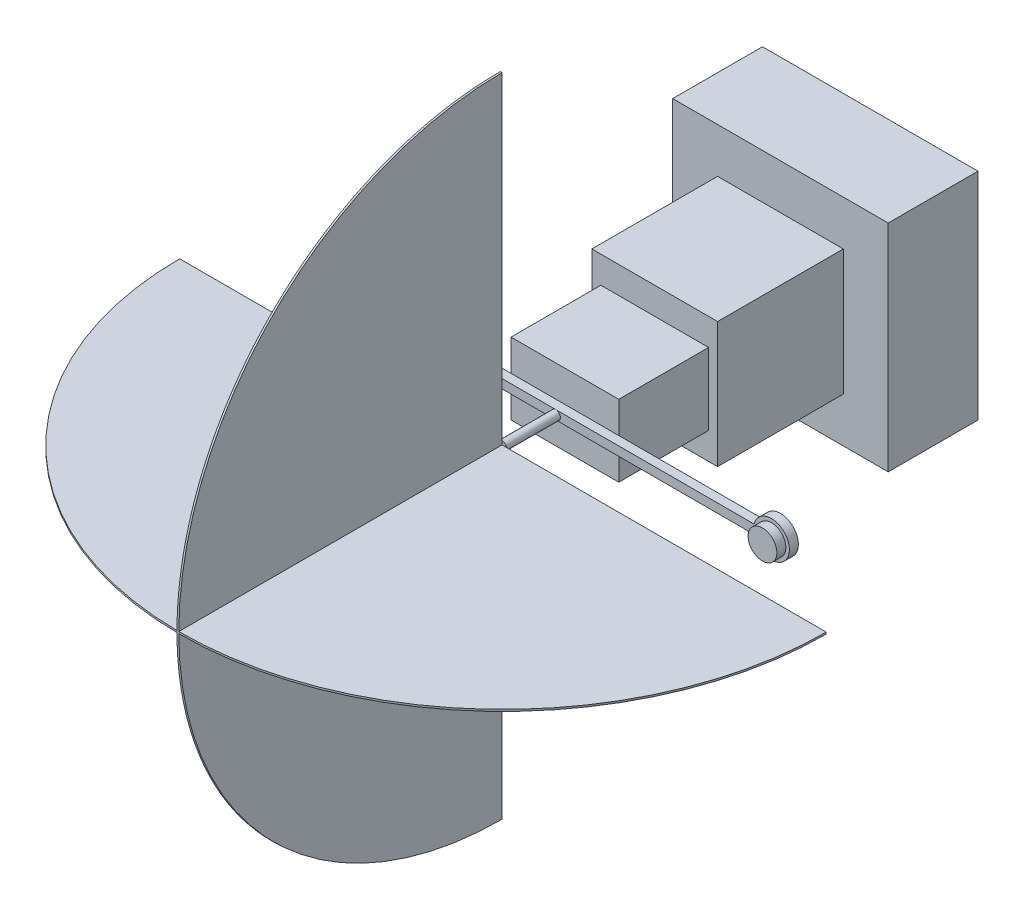
ISO-10303-21;
HEADER;
FILE_DESCRIPTION(('STEP AP214'),'2;1');
FILE_NAME('part.step','',(''),(''),'','','');
FILE_SCHEMA(('AUTOMOTIVE_DESIGN { 1 0 10303 214 1 1 1 1 }'));
ENDSEC;
DATA;
#1=APPLICATION_CONTEXT('core data for automotive mechanical design processes');
#2=APPLICATION_PROTOCOL_DEFINITION('international standard','automotive_design',2000,#1);
#3=PRODUCT_CONTEXT('',#1,'mechanical');
#4=PRODUCT('Part','Part','',(#3));
#5=PRODUCT_RELATED_PRODUCT_CATEGORY('part','',(#4));
#6=PRODUCT_DEFINITION_FORMATION('','',#4);
#7=PRODUCT_DEFINITION_CONTEXT('part definition',#1,'design');
#8=PRODUCT_DEFINITION('design','',#6,#7);
#9=PRODUCT_DEFINITION_SHAPE('','',#8);
#10=(LENGTH_UNIT() NAMED_UNIT(*) SI_UNIT(.MILLI.,.METRE.));
#11=(NAMED_UNIT(*) PLANE_ANGLE_UNIT() SI_UNIT($,.RADIAN.));
#12=(NAMED_UNIT(*) SI_UNIT($,.STERADIAN.) SOLID_ANGLE_UNIT());
#13=UNCERTAINTY_MEASURE_WITH_UNIT(LENGTH_MEASURE(1.E-05),#10,'distance_accuracy_value','');
#14=(GEOMETRIC_REPRESENTATION_CONTEXT(3) GLOBAL_UNCERTAINTY_ASSIGNED_CONTEXT((#13)) GLOBAL_UNIT_ASSIGNED_CONTEXT((#10,
#11,#12)) REPRESENTATION_CONTEXT('',''));
#15=CARTESIAN_POINT('',(0.,0.,0.));
#16=DIRECTION('',(0.,0.,1.));
#17=DIRECTION('',(1.,0.,0.));
#18=AXIS2_PLACEMENT_3D('',#15,#16,#17);
#19=CARTESIAN_POINT('',(0.,0.,35.));
#20=DIRECTION('',(0.,0.,1.));
#21=DIRECTION('',(1.,0.,0.));
#22=AXIS2_PLACEMENT_3D('',#19,#20,#21);
#23=PLANE('',#22);
#24=DIRECTION('',(-1.,0.,0.));
#25=VECTOR('',#24,1.);
#26=CARTESIAN_POINT('',(0.,-0.499999999999996,35.));
#27=LINE('',#26,#25);
#28=CARTESIAN_POINT('',(2.44948974278311,-0.499999999999996,35.));
#29=VERTEX_POINT('',#28);
#30=CARTESIAN_POINT('',(0.,-0.499999999999917,35.));
#31=VERTEX_POINT('',#30);
#32=EDGE_CURVE('E551',#29,#31,#27,.T.);
#33=ORIENTED_EDGE('',*,*,#32,.T.);
#34=DIRECTION('',(0.,-1.,0.));
#35=VECTOR('',#34,1.);
#36=CARTESIAN_POINT('',(0.,180.,35.));
#37=LINE('',#36,#35);
#38=CARTESIAN_POINT('',(0.,-2.5,35.));
#39=VERTEX_POINT('',#38);
#40=EDGE_CURVE('E644',#31,#39,#37,.T.);
#41=ORIENTED_EDGE('',*,*,#40,.T.);
#42=CARTESIAN_POINT('',(0.,0.,35.));
#43=DIRECTION('',(0.,0.,1.));
#44=DIRECTION('',(1.,0.,0.));
#45=AXIS2_PLACEMENT_3D('',#42,#43,#44);
#46=CIRCLE('',#45,2.5);
#47=EDGE_CURVE('E436',#39,#29,#46,.T.);
#48=ORIENTED_EDGE('',*,*,#47,.T.);
#49=EDGE_LOOP('',(#33,#41,#48));
#50=FACE_BOUND('',#49,.T.);
#51=ADVANCED_FACE('F83',(#50),#23,.T.);
#52=CARTESIAN_POINT('',(2.44948974278311,0.500000000000004,35.));
#53=VERTEX_POINT('',#52);
#54=CARTESIAN_POINT('',(0.,2.50000000000006,35.));
#55=VERTEX_POINT('',#54);
#56=EDGE_CURVE('E431',#53,#55,#46,.T.);
#57=ORIENTED_EDGE('',*,*,#56,.T.);
#58=CARTESIAN_POINT('',(0.,0.500000000000084,35.));
#59=VERTEX_POINT('',#58);
#60=EDGE_CURVE('E645',#55,#59,#37,.T.);
#61=ORIENTED_EDGE('',*,*,#60,.T.);
#62=DIRECTION('',(-1.,0.,0.));
#63=VECTOR('',#62,1.);
#64=CARTESIAN_POINT('',(0.,0.500000000000004,35.));
#65=LINE('',#64,#63);
#66=EDGE_CURVE('E555',#53,#59,#65,.T.);
#67=ORIENTED_EDGE('',*,*,#66,.F.);
#68=EDGE_LOOP('',(#57,#61,#67));
#69=FACE_BOUND('',#68,.T.);
#70=ADVANCED_FACE('F618',(#69),#23,.T.);
#71=CARTESIAN_POINT('',(0.499999999999998,0.500000000000004,35.));
#72=DIRECTION('',(0.,-1.,0.));
#73=DIRECTION('',(0.,0.,-1.));
#74=AXIS2_PLACEMENT_3D('',#71,#72,#73);
#75=CYLINDRICAL_SURFACE('',#74,180.);
#76=CARTESIAN_POINT('',(0.499999999999998,0.500000000000004,35.));
#77=DIRECTION('',(0.,-1.,0.));
#78=DIRECTION('',(0.,0.,1.));
#79=AXIS2_PLACEMENT_3D('',#76,#77,#78);
#80=CIRCLE('',#79,180.);
#81=CARTESIAN_POINT('',(180.5,0.500000000000004,35.));
#82=VERTEX_POINT('',#81);
#83=CARTESIAN_POINT('',(0.,0.500000000000026,214.999305554216));
#84=VERTEX_POINT('',#83);
#85=EDGE_CURVE('E407',#82,#84,#80,.T.);
#86=ORIENTED_EDGE('',*,*,#85,.T.);
#87=CARTESIAN_POINT('',(0.,0.,35.));
#88=DIRECTION('',(-1.,0.,0.));
#89=DIRECTION('',(0.,-0.00277777777777813,0.999996141967866));
#90=AXIS2_PLACEMENT_3D('',#87,#88,#89);
#91=CIRCLE('',#90,180.);
#92=CARTESIAN_POINT('',(0.,-0.499999999999974,214.999305554216));
#93=VERTEX_POINT('',#92);
#94=EDGE_CURVE('E356',#93,#84,#91,.T.);
#95=ORIENTED_EDGE('',*,*,#94,.F.);
#96=CARTESIAN_POINT('',(0.499999999999998,-0.499999999999996,35.));
#97=DIRECTION('',(0.,-1.,0.));
#98=DIRECTION('',(0.,0.,1.));
#99=AXIS2_PLACEMENT_3D('',#96,#97,#98);
#100=CIRCLE('',#99,180.);
#101=CARTESIAN_POINT('',(180.5,-0.499999999999996,35.));
#102=VERTEX_POINT('',#101);
#103=EDGE_CURVE('E87',#102,#93,#100,.T.);
#104=ORIENTED_EDGE('',*,*,#103,.F.);
#105=DIRECTION('',(0.,-1.,0.));
#106=VECTOR('',#105,1.);
#107=CARTESIAN_POINT('',(180.5,0.500000000000004,35.));
#108=LINE('',#107,#106);
#109=EDGE_CURVE('E425',#82,#102,#108,.T.);
#110=ORIENTED_EDGE('',*,*,#109,.F.);
#111=EDGE_LOOP('',(#86,#95,#104,#110));
#112=FACE_BOUND('',#111,.T.);
#113=ADVANCED_FACE('F399',(#112),#75,.T.);
#114=CARTESIAN_POINT('',(0.499999999999998,0.500000000000004,35.));
#115=DIRECTION('',(0.,1.,0.));
#116=DIRECTION('',(0.,0.,1.));
#117=AXIS2_PLACEMENT_3D('',#114,#115,#116);
#118=PLANE('',#117);
#119=ORIENTED_EDGE('',*,*,#66,.T.);
#120=DIRECTION('',(0.,0.,1.));
#121=VECTOR('',#120,1.);
#122=CARTESIAN_POINT('',(0.,0.500000000000004,35.));
#123=LINE('',#122,#121);
#124=EDGE_CURVE('E560',#59,#84,#123,.T.);
#125=ORIENTED_EDGE('',*,*,#124,.T.);
#126=ORIENTED_EDGE('',*,*,#85,.F.);
#127=DIRECTION('',(1.,0.,0.));
#128=VECTOR('',#127,1.);
#129=CARTESIAN_POINT('',(-179.5,0.500000000000004,35.));
#130=LINE('',#129,#128);
#131=EDGE_CURVE('E415',#53,#82,#130,.T.);
#132=ORIENTED_EDGE('',*,*,#131,.F.);
#133=EDGE_LOOP('',(#119,#125,#126,#132));
#134=FACE_BOUND('',#133,.T.);
#135=ADVANCED_FACE('F388',(#134),#118,.T.);
#136=CARTESIAN_POINT('',(0.499999999999998,-0.499999999999996,35.));
#137=DIRECTION('',(0.,1.,0.));
#138=DIRECTION('',(0.,0.,1.));
#139=AXIS2_PLACEMENT_3D('',#136,#137,#138);
#140=PLANE('',#139);
#141=DIRECTION('',(0.,0.,1.));
#142=VECTOR('',#141,1.);
#143=CARTESIAN_POINT('',(0.,-0.499999999999996,35.));
#144=LINE('',#143,#142);
#145=EDGE_CURVE('E12',#31,#93,#144,.T.);
#146=ORIENTED_EDGE('',*,*,#145,.F.);
#147=ORIENTED_EDGE('',*,*,#32,.F.);
#148=DIRECTION('',(1.,0.,0.));
#149=VECTOR('',#148,1.);
#150=CARTESIAN_POINT('',(-179.5,-0.499999999999996,35.));
#151=LINE('',#150,#149);
#152=EDGE_CURVE('E606',#29,#102,#151,.T.);
#153=ORIENTED_EDGE('',*,*,#152,.T.);
#154=ORIENTED_EDGE('',*,*,#103,.T.);
#155=EDGE_LOOP('',(#146,#147,#153,#154));
#156=FACE_BOUND('',#155,.T.);
#157=ADVANCED_FACE('F383',(#156),#140,.F.);
#158=DIRECTION('',(0.,-1.,0.));
#159=VECTOR('',#158,1.);
#160=CARTESIAN_POINT('',(-1.,180.,35.));
#161=LINE('',#160,#159);
#162=CARTESIAN_POINT('',(-1.,-0.499999999999917,35.));
#163=VERTEX_POINT('',#162);
#164=CARTESIAN_POINT('',(-1.,-2.29128784747792,35.));
#165=VERTEX_POINT('',#164);
#166=EDGE_CURVE('E581',#163,#165,#161,.T.);
#167=ORIENTED_EDGE('',*,*,#166,.F.);
#168=CARTESIAN_POINT('',(-2.44948974278318,-0.499999999999996,35.));
#169=VERTEX_POINT('',#168);
#170=EDGE_CURVE('E108',#163,#169,#27,.T.);
#171=ORIENTED_EDGE('',*,*,#170,.T.);
#172=EDGE_CURVE('E593',#169,#165,#46,.T.);
#173=ORIENTED_EDGE('',*,*,#172,.T.);
#174=EDGE_LOOP('',(#167,#171,#173));
#175=FACE_BOUND('',#174,.T.);
#176=ADVANCED_FACE('F599',(#175),#23,.T.);
#177=CARTESIAN_POINT('',(0.,0.,5.));
#178=DIRECTION('',(0.,0.,1.));
#179=DIRECTION('',(1.,0.,0.));
#180=AXIS2_PLACEMENT_3D('',#177,#178,#179);
#181=PLANE('',#180);
#182=CARTESIAN_POINT('',(-120.,0.,5.));
#183=DIRECTION('',(0.,0.,1.));
#184=DIRECTION('',(1.,0.,0.));
#185=AXIS2_PLACEMENT_3D('',#182,#183,#184);
#186=CIRCLE('',#185,8.00000000000001);
#187=CARTESIAN_POINT('',(-112.,0.,5.));
#188=VERTEX_POINT('',#187);
#189=EDGE_CURVE('E503',#188,#188,#186,.T.);
#190=ORIENTED_EDGE('',*,*,#189,.F.);
#191=EDGE_LOOP('',(#190));
#192=FACE_BOUND('',#191,.T.);
#193=DIRECTION('',(1.,0.,0.));
#194=VECTOR('',#193,1.);
#195=CARTESIAN_POINT('',(0.,-2.5,5.));
#196=LINE('',#195,#194);
#197=CARTESIAN_POINT('',(-110.317541634481,-2.5,5.));
#198=VERTEX_POINT('',#197);
#199=CARTESIAN_POINT('',(0.,-2.5,5.));
#200=VERTEX_POINT('',#199);
#201=EDGE_CURVE('E517',#198,#200,#196,.T.);
#202=ORIENTED_EDGE('',*,*,#201,.T.);
#203=CARTESIAN_POINT('',(0.,0.,5.));
#204=DIRECTION('',(0.,0.,1.));
#205=DIRECTION('',(1.,0.,0.));
#206=AXIS2_PLACEMENT_3D('',#203,#204,#205);
#207=CIRCLE('',#206,2.5);
#208=CARTESIAN_POINT('',(0.,2.5,5.));
#209=VERTEX_POINT('',#208);
#210=EDGE_CURVE('E438',#209,#200,#207,.T.);
#211=ORIENTED_EDGE('',*,*,#210,.F.);
#212=DIRECTION('',(1.,0.,0.));
#213=VECTOR('',#212,1.);
#214=CARTESIAN_POINT('',(0.,2.5,5.));
#215=LINE('',#214,#213);
#216=CARTESIAN_POINT('',(-110.317541634481,2.5,5.));
#217=VERTEX_POINT('',#216);
#218=EDGE_CURVE('E521',#217,#209,#215,.T.);
#219=ORIENTED_EDGE('',*,*,#218,.F.);
#220=CARTESIAN_POINT('',(-120.,0.,5.));
#221=DIRECTION('',(0.,0.,1.));
#222=DIRECTION('',(1.,0.,0.));
#223=AXIS2_PLACEMENT_3D('',#220,#221,#222);
#224=CIRCLE('',#223,9.99999999999999);
#225=EDGE_CURVE('E512',#217,#198,#224,.T.);
#226=ORIENTED_EDGE('',*,*,#225,.T.);
#227=EDGE_LOOP('',(#202,#211,#219,#226));
#228=FACE_BOUND('',#227,.T.);
#229=ADVANCED_FACE('F630',(#192,#228),#181,.T.);
#230=CARTESIAN_POINT('',(120.,0.,5.));
#231=DIRECTION('',(0.,0.,1.));
#232=DIRECTION('',(1.,0.,0.));
#233=AXIS2_PLACEMENT_3D('',#230,#231,#232);
#234=CIRCLE('',#233,8.00000000000001);
#235=CARTESIAN_POINT('',(128.,0.,5.));
#236=VERTEX_POINT('',#235);
#237=EDGE_CURVE('E499',#236,#236,#234,.T.);
#238=ORIENTED_EDGE('',*,*,#237,.F.);
#239=EDGE_LOOP('',(#238));
#240=FACE_BOUND('',#239,.T.);
#241=CARTESIAN_POINT('',(110.317541634481,2.5,5.));
#242=VERTEX_POINT('',#241);
#243=EDGE_CURVE('E520',#209,#242,#215,.T.);
#244=ORIENTED_EDGE('',*,*,#243,.F.);
#245=EDGE_CURVE('E428',#200,#209,#207,.T.);
#246=ORIENTED_EDGE('',*,*,#245,.F.);
#247=CARTESIAN_POINT('',(110.317541634481,-2.5,5.));
#248=VERTEX_POINT('',#247);
#249=EDGE_CURVE('E515',#200,#248,#196,.T.);
#250=ORIENTED_EDGE('',*,*,#249,.T.);
#251=CARTESIAN_POINT('',(120.,0.,5.));
#252=DIRECTION('',(0.,0.,1.));
#253=DIRECTION('',(1.,0.,0.));
#254=AXIS2_PLACEMENT_3D('',#251,#252,#253);
#255=CIRCLE('',#254,10.);
#256=EDGE_CURVE('E541',#248,#242,#255,.T.);
#257=ORIENTED_EDGE('',*,*,#256,.T.);
#258=EDGE_LOOP('',(#244,#246,#250,#257));
#259=FACE_BOUND('',#258,.T.);
#260=ADVANCED_FACE('F636',(#240,#259),#181,.T.);
#261=CARTESIAN_POINT('',(0.,0.,0.));
#262=DIRECTION('',(0.,0.,1.));
#263=DIRECTION('',(1.,0.,0.));
#264=AXIS2_PLACEMENT_3D('',#261,#262,#263);
#265=PLANE('',#264);
#266=DIRECTION('',(0.,1.,0.));
#267=VECTOR('',#266,1.);
#268=CARTESIAN_POINT('',(-30.,-20.,0.));
#269=LINE('',#268,#267);
#270=CARTESIAN_POINT('',(-30.,-2.5,0.));
#271=VERTEX_POINT('',#270);
#272=CARTESIAN_POINT('',(-30.,2.5,0.));
#273=VERTEX_POINT('',#272);
#274=EDGE_CURVE('E480',#271,#273,#269,.T.);
#275=ORIENTED_EDGE('',*,*,#274,.F.);
#276=DIRECTION('',(1.,0.,0.));
#277=VECTOR('',#276,1.);
#278=CARTESIAN_POINT('',(0.,-2.5,0.));
#279=LINE('',#278,#277);
#280=CARTESIAN_POINT('',(-110.317541634481,-2.5,0.));
#281=VERTEX_POINT('',#280);
#282=EDGE_CURVE('E530',#281,#271,#279,.T.);
#283=ORIENTED_EDGE('',*,*,#282,.F.);
#284=CARTESIAN_POINT('',(-120.,0.,0.));
#285=DIRECTION('',(0.,0.,1.));
#286=DIRECTION('',(1.,0.,0.));
#287=AXIS2_PLACEMENT_3D('',#284,#285,#286);
#288=CIRCLE('',#287,9.99999999999999);
#289=CARTESIAN_POINT('',(-110.317541634481,2.5,0.));
#290=VERTEX_POINT('',#289);
#291=EDGE_CURVE('E525',#290,#281,#288,.T.);
#292=ORIENTED_EDGE('',*,*,#291,.F.);
#293=DIRECTION('',(1.,0.,0.));
#294=VECTOR('',#293,1.);
#295=CARTESIAN_POINT('',(0.,2.5,0.));
#296=LINE('',#295,#294);
#297=EDGE_CURVE('E516',#290,#273,#296,.T.);
#298=ORIENTED_EDGE('',*,*,#297,.T.);
#299=EDGE_LOOP('',(#275,#283,#292,#298));
#300=FACE_BOUND('',#299,.T.);
#301=ADVANCED_FACE('F910',(#300),#265,.F.);
#302=DIRECTION('',(0.,-1.,0.));
#303=VECTOR('',#302,1.);
#304=CARTESIAN_POINT('',(30.,-20.,0.));
#305=LINE('',#304,#303);
#306=CARTESIAN_POINT('',(30.,2.5,0.));
#307=VERTEX_POINT('',#306);
#308=CARTESIAN_POINT('',(30.,-2.5,0.));
#309=VERTEX_POINT('',#308);
#310=EDGE_CURVE('E486',#307,#309,#305,.T.);
#311=ORIENTED_EDGE('',*,*,#310,.F.);
#312=CARTESIAN_POINT('',(110.317541634481,2.5,0.));
#313=VERTEX_POINT('',#312);
#314=EDGE_CURVE('E533',#307,#313,#296,.T.);
#315=ORIENTED_EDGE('',*,*,#314,.T.);
#316=CARTESIAN_POINT('',(120.,0.,0.));
#317=DIRECTION('',(0.,0.,1.));
#318=DIRECTION('',(1.,0.,0.));
#319=AXIS2_PLACEMENT_3D('',#316,#317,#318);
#320=CIRCLE('',#319,10.);
#321=CARTESIAN_POINT('',(110.317541634481,-2.5,0.));
#322=VERTEX_POINT('',#321);
#323=EDGE_CURVE('E509',#322,#313,#320,.T.);
#324=ORIENTED_EDGE('',*,*,#323,.F.);
#325=EDGE_CURVE('E528',#309,#322,#279,.T.);
#326=ORIENTED_EDGE('',*,*,#325,.F.);
#327=EDGE_LOOP('',(#311,#315,#324,#326));
#328=FACE_BOUND('',#327,.T.);
#329=ADVANCED_FACE('F891',(#328),#265,.F.);
#330=CARTESIAN_POINT('',(0.,-2.5,5.));
#331=DIRECTION('',(0.,1.,0.));
#332=DIRECTION('',(0.,0.,1.));
#333=AXIS2_PLACEMENT_3D('',#330,#331,#332);
#334=PLANE('',#333);
#335=ORIENTED_EDGE('',*,*,#282,.T.);
#336=EDGE_CURVE('E534',#271,#309,#279,.T.);
#337=ORIENTED_EDGE('',*,*,#336,.T.);
#338=ORIENTED_EDGE('',*,*,#325,.T.);
#339=DIRECTION('',(0.,0.,-1.));
#340=VECTOR('',#339,1.);
#341=CARTESIAN_POINT('',(110.317541634481,-2.5,5.));
#342=LINE('',#341,#340);
#343=EDGE_CURVE('E529',#248,#322,#342,.T.);
#344=ORIENTED_EDGE('',*,*,#343,.F.);
#345=ORIENTED_EDGE('',*,*,#249,.F.);
#346=ORIENTED_EDGE('',*,*,#201,.F.);
#347=DIRECTION('',(0.,0.,-1.));
#348=VECTOR('',#347,1.);
#349=CARTESIAN_POINT('',(-110.317541634481,-2.5,5.));
#350=LINE('',#349,#348);
#351=EDGE_CURVE('E539',#198,#281,#350,.T.);
#352=ORIENTED_EDGE('',*,*,#351,.T.);
#353=EDGE_LOOP('',(#335,#337,#338,#344,#345,#346,#352));
#354=FACE_BOUND('',#353,.T.);
#355=ADVANCED_FACE('F884',(#354),#334,.F.);
#356=CARTESIAN_POINT('',(0.,2.5,5.));
#357=DIRECTION('',(0.,1.,0.));
#358=DIRECTION('',(0.,0.,1.));
#359=AXIS2_PLACEMENT_3D('',#356,#357,#358);
#360=PLANE('',#359);
#361=ORIENTED_EDGE('',*,*,#297,.F.);
#362=DIRECTION('',(0.,0.,-1.));
#363=VECTOR('',#362,1.);
#364=CARTESIAN_POINT('',(-110.317541634481,2.5,5.));
#365=LINE('',#364,#363);
#366=EDGE_CURVE('E524',#217,#290,#365,.T.);
#367=ORIENTED_EDGE('',*,*,#366,.F.);
#368=ORIENTED_EDGE('',*,*,#218,.T.);
#369=ORIENTED_EDGE('',*,*,#243,.T.);
#370=DIRECTION('',(0.,0.,-1.));
#371=VECTOR('',#370,1.);
#372=CARTESIAN_POINT('',(110.317541634481,2.5,5.));
#373=LINE('',#372,#371);
#374=EDGE_CURVE('E544',#242,#313,#373,.T.);
#375=ORIENTED_EDGE('',*,*,#374,.T.);
#376=ORIENTED_EDGE('',*,*,#314,.F.);
#377=EDGE_CURVE('E537',#273,#307,#296,.T.);
#378=ORIENTED_EDGE('',*,*,#377,.F.);
#379=EDGE_LOOP('',(#361,#367,#368,#369,#375,#376,#378));
#380=FACE_BOUND('',#379,.T.);
#381=ADVANCED_FACE('F896',(#380),#360,.T.);
#382=CARTESIAN_POINT('',(-120.,0.,5.));
#383=DIRECTION('',(0.,0.,-1.));
#384=DIRECTION('',(-1.,0.,0.));
#385=AXIS2_PLACEMENT_3D('',#382,#383,#384);
#386=CYLINDRICAL_SURFACE('',#385,9.99999999999999);
#387=ORIENTED_EDGE('',*,*,#291,.T.);
#388=ORIENTED_EDGE('',*,*,#351,.F.);
#389=ORIENTED_EDGE('',*,*,#225,.F.);
#390=ORIENTED_EDGE('',*,*,#366,.T.);
#391=EDGE_LOOP('',(#387,#388,#389,#390));
#392=FACE_BOUND('',#391,.T.);
#393=ADVANCED_FACE('F906',(#392),#386,.T.);
#394=CARTESIAN_POINT('',(120.,0.,5.));
#395=DIRECTION('',(0.,0.,-1.));
#396=DIRECTION('',(-1.,0.,0.));
#397=AXIS2_PLACEMENT_3D('',#394,#395,#396);
#398=CYLINDRICAL_SURFACE('',#397,10.);
#399=ORIENTED_EDGE('',*,*,#323,.T.);
#400=ORIENTED_EDGE('',*,*,#374,.F.);
#401=ORIENTED_EDGE('',*,*,#256,.F.);
#402=ORIENTED_EDGE('',*,*,#343,.T.);
#403=EDGE_LOOP('',(#399,#400,#401,#402));
#404=FACE_BOUND('',#403,.T.);
#405=ADVANCED_FACE('F85',(#404),#398,.T.);
#406=CARTESIAN_POINT('',(-120.,0.,10.));
#407=DIRECTION('',(0.,0.,-1.));
#408=DIRECTION('',(-1.,0.,0.));
#409=AXIS2_PLACEMENT_3D('',#406,#407,#408);
#410=CYLINDRICAL_SURFACE('',#409,8.00000000000001);
#411=CARTESIAN_POINT('',(-120.,0.,10.));
#412=DIRECTION('',(0.,0.,1.));
#413=DIRECTION('',(1.,0.,0.));
#414=AXIS2_PLACEMENT_3D('',#411,#412,#413);
#415=CIRCLE('',#414,8.00000000000001);
#416=CARTESIAN_POINT('',(-112.,0.,10.));
#417=VERTEX_POINT('',#416);
#418=EDGE_CURVE('E506',#417,#417,#415,.T.);
#419=ORIENTED_EDGE('',*,*,#418,.F.);
#420=EDGE_LOOP('',(#419));
#421=FACE_BOUND('',#420,.T.);
#422=ORIENTED_EDGE('',*,*,#189,.T.);
#423=EDGE_LOOP('',(#422));
#424=FACE_BOUND('',#423,.T.);
#425=ADVANCED_FACE('F942',(#421,#424),#410,.T.);
#426=CARTESIAN_POINT('',(-120.,0.,10.));
#427=DIRECTION('',(0.,0.,1.));
#428=DIRECTION('',(1.,0.,0.));
#429=AXIS2_PLACEMENT_3D('',#426,#427,#428);
#430=PLANE('',#429);
#431=ORIENTED_EDGE('',*,*,#418,.T.);
#432=EDGE_LOOP('',(#431));
#433=FACE_BOUND('',#432,.T.);
#434=ADVANCED_FACE('F938',(#433),#430,.T.);
#435=CARTESIAN_POINT('',(120.,0.,10.));
#436=DIRECTION('',(0.,0.,-1.));
#437=DIRECTION('',(-1.,0.,0.));
#438=AXIS2_PLACEMENT_3D('',#435,#436,#437);
#439=CYLINDRICAL_SURFACE('',#438,8.00000000000001);
#440=CARTESIAN_POINT('',(120.,0.,10.));
#441=DIRECTION('',(0.,0.,1.));
#442=DIRECTION('',(1.,0.,0.));
#443=AXIS2_PLACEMENT_3D('',#440,#441,#442);
#444=CIRCLE('',#443,8.00000000000001);
#445=CARTESIAN_POINT('',(128.,0.,10.));
#446=VERTEX_POINT('',#445);
#447=EDGE_CURVE('E500',#446,#446,#444,.T.);
#448=ORIENTED_EDGE('',*,*,#447,.F.);
#449=EDGE_LOOP('',(#448));
#450=FACE_BOUND('',#449,.T.);
#451=ORIENTED_EDGE('',*,*,#237,.T.);
#452=EDGE_LOOP('',(#451));
#453=FACE_BOUND('',#452,.T.);
#454=ADVANCED_FACE('F934',(#450,#453),#439,.T.);
#455=CARTESIAN_POINT('',(120.,0.,10.));
#456=DIRECTION('',(0.,0.,1.));
#457=DIRECTION('',(1.,0.,0.));
#458=AXIS2_PLACEMENT_3D('',#455,#456,#457);
#459=PLANE('',#458);
#460=ORIENTED_EDGE('',*,*,#447,.T.);
#461=EDGE_LOOP('',(#460));
#462=FACE_BOUND('',#461,.T.);
#463=ADVANCED_FACE('F931',(#462),#459,.T.);
#464=CARTESIAN_POINT('',(0.,0.,0.));
#465=DIRECTION('',(0.,0.,1.));
#466=DIRECTION('',(1.,0.,0.));
#467=AXIS2_PLACEMENT_3D('',#464,#465,#466);
#468=PLANE('',#467);
#469=ORIENTED_EDGE('',*,*,#336,.F.);
#470=CARTESIAN_POINT('',(-30.,-20.,0.));
#471=VERTEX_POINT('',#470);
#472=EDGE_CURVE('E476',#471,#271,#269,.T.);
#473=ORIENTED_EDGE('',*,*,#472,.F.);
#474=DIRECTION('',(-1.,0.,0.));
#475=VECTOR('',#474,1.);
#476=CARTESIAN_POINT('',(30.,-20.,0.));
#477=LINE('',#476,#475);
#478=CARTESIAN_POINT('',(30.,-20.,0.));
#479=VERTEX_POINT('',#478);
#480=EDGE_CURVE('E466',#479,#471,#477,.T.);
#481=ORIENTED_EDGE('',*,*,#480,.F.);
#482=EDGE_CURVE('E482',#309,#479,#305,.T.);
#483=ORIENTED_EDGE('',*,*,#482,.F.);
#484=EDGE_LOOP('',(#469,#473,#481,#483));
#485=FACE_BOUND('',#484,.T.);
#486=ADVANCED_FACE('F878',(#485),#468,.T.);
#487=CARTESIAN_POINT('',(-30.,-20.,-50.));
#488=DIRECTION('',(1.,0.,0.));
#489=DIRECTION('',(0.,0.,-1.));
#490=AXIS2_PLACEMENT_3D('',#487,#488,#489);
#491=PLANE('',#490);
#492=ORIENTED_EDGE('',*,*,#472,.T.);
#493=ORIENTED_EDGE('',*,*,#274,.T.);
#494=CARTESIAN_POINT('',(-30.,20.,0.));
#495=VERTEX_POINT('',#494);
#496=EDGE_CURVE('E461',#273,#495,#269,.T.);
#497=ORIENTED_EDGE('',*,*,#496,.T.);
#498=DIRECTION('',(0.,0.,1.));
#499=VECTOR('',#498,1.);
#500=CARTESIAN_POINT('',(-30.,20.,-50.));
#501=LINE('',#500,#499);
#502=CARTESIAN_POINT('',(-30.,20.,-50.));
#503=VERTEX_POINT('',#502);
#504=EDGE_CURVE('E496',#503,#495,#501,.T.);
#505=ORIENTED_EDGE('',*,*,#504,.F.);
#506=DIRECTION('',(0.,1.,0.));
#507=VECTOR('',#506,1.);
#508=CARTESIAN_POINT('',(-30.,-20.,-50.));
#509=LINE('',#508,#507);
#510=CARTESIAN_POINT('',(-30.,-20.,-50.));
#511=VERTEX_POINT('',#510);
#512=EDGE_CURVE('E462',#511,#503,#509,.T.);
#513=ORIENTED_EDGE('',*,*,#512,.F.);
#514=DIRECTION('',(0.,0.,1.));
#515=VECTOR('',#514,1.);
#516=CARTESIAN_POINT('',(-30.,-20.,-50.));
#517=LINE('',#516,#515);
#518=EDGE_CURVE('E475',#511,#471,#517,.T.);
#519=ORIENTED_EDGE('',*,*,#518,.T.);
#520=EDGE_LOOP('',(#492,#493,#497,#505,#513,#519));
#521=FACE_BOUND('',#520,.T.);
#522=ADVANCED_FACE('F873',(#521),#491,.F.);
#523=CARTESIAN_POINT('',(30.,20.,-50.));
#524=DIRECTION('',(0.,-1.,0.));
#525=DIRECTION('',(0.,0.,-1.));
#526=AXIS2_PLACEMENT_3D('',#523,#524,#525);
#527=PLANE('',#526);
#528=DIRECTION('',(1.,0.,0.));
#529=VECTOR('',#528,1.);
#530=CARTESIAN_POINT('',(30.,20.,0.));
#531=LINE('',#530,#529);
#532=CARTESIAN_POINT('',(30.,20.,0.));
#533=VERTEX_POINT('',#532);
#534=EDGE_CURVE('E479',#495,#533,#531,.T.);
#535=ORIENTED_EDGE('',*,*,#534,.T.);
#536=DIRECTION('',(0.,0.,1.));
#537=VECTOR('',#536,1.);
#538=CARTESIAN_POINT('',(30.,20.,-50.));
#539=LINE('',#538,#537);
#540=CARTESIAN_POINT('',(30.,20.,-50.));
#541=VERTEX_POINT('',#540);
#542=EDGE_CURVE('E493',#541,#533,#539,.T.);
#543=ORIENTED_EDGE('',*,*,#542,.F.);
#544=DIRECTION('',(1.,0.,0.));
#545=VECTOR('',#544,1.);
#546=CARTESIAN_POINT('',(30.,20.,-50.));
#547=LINE('',#546,#545);
#548=EDGE_CURVE('E465',#503,#541,#547,.T.);
#549=ORIENTED_EDGE('',*,*,#548,.F.);
#550=ORIENTED_EDGE('',*,*,#504,.T.);
#551=EDGE_LOOP('',(#535,#543,#549,#550));
#552=FACE_BOUND('',#551,.T.);
#553=ADVANCED_FACE('F916',(#552),#527,.F.);
#554=CARTESIAN_POINT('',(30.,-20.,-50.));
#555=DIRECTION('',(-1.,0.,0.));
#556=DIRECTION('',(0.,0.,1.));
#557=AXIS2_PLACEMENT_3D('',#554,#555,#556);
#558=PLANE('',#557);
#559=EDGE_CURVE('E483',#533,#307,#305,.T.);
#560=ORIENTED_EDGE('',*,*,#559,.T.);
#561=ORIENTED_EDGE('',*,*,#310,.T.);
#562=ORIENTED_EDGE('',*,*,#482,.T.);
#563=DIRECTION('',(0.,0.,1.));
#564=VECTOR('',#563,1.);
#565=CARTESIAN_POINT('',(30.,-20.,-50.));
#566=LINE('',#565,#564);
#567=CARTESIAN_POINT('',(30.,-20.,-50.));
#568=VERTEX_POINT('',#567);
#569=EDGE_CURVE('E490',#568,#479,#566,.T.);
#570=ORIENTED_EDGE('',*,*,#569,.F.);
#571=DIRECTION('',(0.,-1.,0.));
#572=VECTOR('',#571,1.);
#573=CARTESIAN_POINT('',(30.,-20.,-50.));
#574=LINE('',#573,#572);
#575=EDGE_CURVE('E469',#541,#568,#574,.T.);
#576=ORIENTED_EDGE('',*,*,#575,.F.);
#577=ORIENTED_EDGE('',*,*,#542,.T.);
#578=EDGE_LOOP('',(#560,#561,#562,#570,#576,#577));
#579=FACE_BOUND('',#578,.T.);
#580=ADVANCED_FACE('F918',(#579),#558,.F.);
#581=CARTESIAN_POINT('',(30.,-20.,-50.));
#582=DIRECTION('',(0.,1.,0.));
#583=DIRECTION('',(0.,0.,1.));
#584=AXIS2_PLACEMENT_3D('',#581,#582,#583);
#585=PLANE('',#584);
#586=ORIENTED_EDGE('',*,*,#480,.T.);
#587=ORIENTED_EDGE('',*,*,#518,.F.);
#588=DIRECTION('',(-1.,0.,0.));
#589=VECTOR('',#588,1.);
#590=CARTESIAN_POINT('',(30.,-20.,-50.));
#591=LINE('',#590,#589);
#592=EDGE_CURVE('E472',#568,#511,#591,.T.);
#593=ORIENTED_EDGE('',*,*,#592,.F.);
#594=ORIENTED_EDGE('',*,*,#569,.T.);
#595=EDGE_LOOP('',(#586,#587,#593,#594));
#596=FACE_BOUND('',#595,.T.);
#597=ADVANCED_FACE('F869',(#596),#585,.F.);
#598=ORIENTED_EDGE('',*,*,#496,.F.);
#599=ORIENTED_EDGE('',*,*,#377,.T.);
#600=ORIENTED_EDGE('',*,*,#559,.F.);
#601=ORIENTED_EDGE('',*,*,#534,.F.);
#602=EDGE_LOOP('',(#598,#599,#600,#601));
#603=FACE_BOUND('',#602,.T.);
#604=ADVANCED_FACE('F863',(#603),#468,.T.);
#605=CARTESIAN_POINT('',(0.,0.,-50.));
#606=DIRECTION('',(0.,0.,-1.));
#607=DIRECTION('',(-1.,0.,0.));
#608=AXIS2_PLACEMENT_3D('',#605,#606,#607);
#609=PLANE('',#608);
#610=DIRECTION('',(0.,1.,0.));
#611=VECTOR('',#610,1.);
#612=CARTESIAN_POINT('',(-35.,35.,-50.));
#613=LINE('',#612,#611);
#614=CARTESIAN_POINT('',(-35.,-35.,-50.));
#615=VERTEX_POINT('',#614);
#616=CARTESIAN_POINT('',(-35.,35.,-50.));
#617=VERTEX_POINT('',#616);
#618=EDGE_CURVE('E434',#615,#617,#613,.T.);
#619=ORIENTED_EDGE('',*,*,#618,.F.);
#620=DIRECTION('',(-1.,0.,0.));
#621=VECTOR('',#620,1.);
#622=CARTESIAN_POINT('',(35.,-35.,-50.));
#623=LINE('',#622,#621);
#624=CARTESIAN_POINT('',(35.,-35.,-50.));
#625=VERTEX_POINT('',#624);
#626=EDGE_CURVE('E447',#625,#615,#623,.T.);
#627=ORIENTED_EDGE('',*,*,#626,.F.);
#628=DIRECTION('',(0.,-1.,0.));
#629=VECTOR('',#628,1.);
#630=CARTESIAN_POINT('',(35.,35.,-50.));
#631=LINE('',#630,#629);
#632=CARTESIAN_POINT('',(35.,35.,-50.));
#633=VERTEX_POINT('',#632);
#634=EDGE_CURVE('E445',#633,#625,#631,.T.);
#635=ORIENTED_EDGE('',*,*,#634,.F.);
#636=DIRECTION('',(1.,0.,0.));
#637=VECTOR('',#636,1.);
#638=CARTESIAN_POINT('',(35.,35.,-50.));
#639=LINE('',#638,#637);
#640=EDGE_CURVE('E443',#617,#633,#639,.T.);
#641=ORIENTED_EDGE('',*,*,#640,.F.);
#642=EDGE_LOOP('',(#619,#627,#635,#641));
#643=FACE_BOUND('',#642,.T.);
#644=ORIENTED_EDGE('',*,*,#592,.T.);
#645=ORIENTED_EDGE('',*,*,#512,.T.);
#646=ORIENTED_EDGE('',*,*,#548,.T.);
#647=ORIENTED_EDGE('',*,*,#575,.T.);
#648=EDGE_LOOP('',(#644,#645,#646,#647));
#649=FACE_BOUND('',#648,.T.);
#650=ADVANCED_FACE('F761',(#643,#649),#609,.F.);
#651=CARTESIAN_POINT('',(-35.,35.,-80.));
#652=DIRECTION('',(1.,0.,0.));
#653=DIRECTION('',(0.,1.,0.));
#654=AXIS2_PLACEMENT_3D('',#651,#652,#653);
#655=PLANE('',#654);
#656=ORIENTED_EDGE('',*,*,#618,.T.);
#657=DIRECTION('',(0.,0.,1.));
#658=VECTOR('',#657,1.);
#659=CARTESIAN_POINT('',(-35.,35.,-80.));
#660=LINE('',#659,#658);
#661=CARTESIAN_POINT('',(-35.,35.,-120.));
#662=VERTEX_POINT('',#661);
#663=EDGE_CURVE('E458',#662,#617,#660,.T.);
#664=ORIENTED_EDGE('',*,*,#663,.F.);
#665=DIRECTION('',(0.,1.,0.));
#666=VECTOR('',#665,1.);
#667=CARTESIAN_POINT('',(-35.,35.,-120.));
#668=LINE('',#667,#666);
#669=CARTESIAN_POINT('',(-35.,-35.,-120.));
#670=VERTEX_POINT('',#669);
#671=EDGE_CURVE('E314',#670,#662,#668,.T.);
#672=ORIENTED_EDGE('',*,*,#671,.F.);
#673=DIRECTION('',(0.,0.,1.));
#674=VECTOR('',#673,1.);
#675=CARTESIAN_POINT('',(-35.,-35.,-80.));
#676=LINE('',#675,#674);
#677=EDGE_CURVE('E449',#670,#615,#676,.T.);
#678=ORIENTED_EDGE('',*,*,#677,.T.);
#679=EDGE_LOOP('',(#656,#664,#672,#678));
#680=FACE_BOUND('',#679,.T.);
#681=ADVANCED_FACE('F757',(#680),#655,.F.);
#682=CARTESIAN_POINT('',(35.,35.,-80.));
#683=DIRECTION('',(0.,-1.,0.));
#684=DIRECTION('',(0.,0.,-1.));
#685=AXIS2_PLACEMENT_3D('',#682,#683,#684);
#686=PLANE('',#685);
#687=ORIENTED_EDGE('',*,*,#640,.T.);
#688=DIRECTION('',(0.,0.,1.));
#689=VECTOR('',#688,1.);
#690=CARTESIAN_POINT('',(35.,35.,-80.));
#691=LINE('',#690,#689);
#692=CARTESIAN_POINT('',(35.,35.,-120.));
#693=VERTEX_POINT('',#692);
#694=EDGE_CURVE('E455',#693,#633,#691,.T.);
#695=ORIENTED_EDGE('',*,*,#694,.F.);
#696=DIRECTION('',(1.,0.,0.));
#697=VECTOR('',#696,1.);
#698=CARTESIAN_POINT('',(35.,35.,-120.));
#699=LINE('',#698,#697);
#700=EDGE_CURVE('E317',#662,#693,#699,.T.);
#701=ORIENTED_EDGE('',*,*,#700,.F.);
#702=ORIENTED_EDGE('',*,*,#663,.T.);
#703=EDGE_LOOP('',(#687,#695,#701,#702));
#704=FACE_BOUND('',#703,.T.);
#705=ADVANCED_FACE('F760',(#704),#686,.F.);
#706=CARTESIAN_POINT('',(35.,35.,-80.));
#707=DIRECTION('',(-1.,0.,0.));
#708=DIRECTION('',(0.,-1.,0.));
#709=AXIS2_PLACEMENT_3D('',#706,#707,#708);
#710=PLANE('',#709);
#711=ORIENTED_EDGE('',*,*,#634,.T.);
#712=DIRECTION('',(0.,0.,1.));
#713=VECTOR('',#712,1.);
#714=CARTESIAN_POINT('',(35.,-35.,-80.));
#715=LINE('',#714,#713);
#716=CARTESIAN_POINT('',(35.,-35.,-120.));
#717=VERTEX_POINT('',#716);
#718=EDGE_CURVE('E452',#717,#625,#715,.T.);
#719=ORIENTED_EDGE('',*,*,#718,.F.);
#720=DIRECTION('',(0.,-1.,0.));
#721=VECTOR('',#720,1.);
#722=CARTESIAN_POINT('',(35.,35.,-120.));
#723=LINE('',#722,#721);
#724=EDGE_CURVE('E325',#693,#717,#723,.T.);
#725=ORIENTED_EDGE('',*,*,#724,.F.);
#726=ORIENTED_EDGE('',*,*,#694,.T.);
#727=EDGE_LOOP('',(#711,#719,#725,#726));
#728=FACE_BOUND('',#727,.T.);
#729=ADVANCED_FACE('F768',(#728),#710,.F.);
#730=CARTESIAN_POINT('',(35.,-35.,-80.));
#731=DIRECTION('',(0.,1.,0.));
#732=DIRECTION('',(0.,0.,1.));
#733=AXIS2_PLACEMENT_3D('',#730,#731,#732);
#734=PLANE('',#733);
#735=ORIENTED_EDGE('',*,*,#626,.T.);
#736=ORIENTED_EDGE('',*,*,#677,.F.);
#737=DIRECTION('',(-1.,0.,0.));
#738=VECTOR('',#737,1.);
#739=CARTESIAN_POINT('',(35.,-35.,-120.));
#740=LINE('',#739,#738);
#741=EDGE_CURVE('E328',#717,#670,#740,.T.);
#742=ORIENTED_EDGE('',*,*,#741,.F.);
#743=ORIENTED_EDGE('',*,*,#718,.T.);
#744=EDGE_LOOP('',(#735,#736,#742,#743));
#745=FACE_BOUND('',#744,.T.);
#746=ADVANCED_FACE('F628',(#745),#734,.F.);
#747=CARTESIAN_POINT('',(0.,0.,35.));
#748=DIRECTION('',(0.,0.,-1.));
#749=DIRECTION('',(-1.,0.,0.));
#750=AXIS2_PLACEMENT_3D('',#747,#748,#749);
#751=CYLINDRICAL_SURFACE('',#750,2.5);
#752=ORIENTED_EDGE('',*,*,#56,.F.);
#753=EDGE_CURVE('E440',#29,#53,#46,.T.);
#754=ORIENTED_EDGE('',*,*,#753,.F.);
#755=ORIENTED_EDGE('',*,*,#47,.F.);
#756=CARTESIAN_POINT('',(0.,0.,35.));
#757=DIRECTION('',(0.,0.,-1.));
#758=DIRECTION('',(0.,1.,0.));
#759=AXIS2_PLACEMENT_3D('',#756,#757,#758);
#760=CIRCLE('',#759,2.5);
#761=EDGE_CURVE('E565',#39,#165,#760,.T.);
#762=ORIENTED_EDGE('',*,*,#761,.T.);
#763=ORIENTED_EDGE('',*,*,#172,.F.);
#764=CARTESIAN_POINT('',(-2.44948974278322,0.500000000000004,35.));
#765=VERTEX_POINT('',#764);
#766=EDGE_CURVE('E437',#765,#169,#46,.T.);
#767=ORIENTED_EDGE('',*,*,#766,.F.);
#768=CARTESIAN_POINT('',(-1.,2.29128784747798,35.));
#769=VERTEX_POINT('',#768);
#770=EDGE_CURVE('E435',#769,#765,#46,.T.);
#771=ORIENTED_EDGE('',*,*,#770,.F.);
#772=EDGE_CURVE('E562',#769,#55,#760,.T.);
#773=ORIENTED_EDGE('',*,*,#772,.T.);
#774=EDGE_LOOP('',(#752,#754,#755,#762,#763,#767,#771,#773));
#775=FACE_BOUND('',#774,.T.);
#776=ORIENTED_EDGE('',*,*,#210,.T.);
#777=ORIENTED_EDGE('',*,*,#245,.T.);
#778=EDGE_LOOP('',(#776,#777));
#779=FACE_BOUND('',#778,.T.);
#780=ADVANCED_FACE('F601',(#775,#779),#751,.T.);
#781=CARTESIAN_POINT('',(-1.,0.500000000000084,35.));
#782=VERTEX_POINT('',#781);
#783=EDGE_CURVE('E339',#769,#782,#161,.T.);
#784=ORIENTED_EDGE('',*,*,#783,.F.);
#785=ORIENTED_EDGE('',*,*,#770,.T.);
#786=EDGE_CURVE('E554',#782,#765,#65,.T.);
#787=ORIENTED_EDGE('',*,*,#786,.F.);
#788=EDGE_LOOP('',(#784,#785,#787));
#789=FACE_BOUND('',#788,.T.);
#790=ADVANCED_FACE('F393',(#789),#23,.T.);
#791=CARTESIAN_POINT('',(-179.5,0.500000000000004,35.));
#792=DIRECTION('',(0.,0.,-1.));
#793=DIRECTION('',(0.,1.,0.));
#794=AXIS2_PLACEMENT_3D('',#791,#792,#793);
#795=PLANE('',#794);
#796=ORIENTED_EDGE('',*,*,#753,.T.);
#797=ORIENTED_EDGE('',*,*,#131,.T.);
#798=ORIENTED_EDGE('',*,*,#109,.T.);
#799=ORIENTED_EDGE('',*,*,#152,.F.);
#800=EDGE_LOOP('',(#796,#797,#798,#799));
#801=FACE_BOUND('',#800,.T.);
#802=ADVANCED_FACE('F389',(#801),#795,.T.);
#803=ORIENTED_EDGE('',*,*,#766,.T.);
#804=CARTESIAN_POINT('',(-179.5,-0.499999999999996,35.));
#805=VERTEX_POINT('',#804);
#806=EDGE_CURVE('E420',#805,#169,#151,.T.);
#807=ORIENTED_EDGE('',*,*,#806,.F.);
#808=DIRECTION('',(0.,-1.,0.));
#809=VECTOR('',#808,1.);
#810=CARTESIAN_POINT('',(-179.5,0.500000000000004,35.));
#811=LINE('',#810,#809);
#812=CARTESIAN_POINT('',(-179.5,0.500000000000004,35.));
#813=VERTEX_POINT('',#812);
#814=EDGE_CURVE('E424',#813,#805,#811,.T.);
#815=ORIENTED_EDGE('',*,*,#814,.F.);
#816=EDGE_CURVE('E421',#813,#765,#130,.T.);
#817=ORIENTED_EDGE('',*,*,#816,.T.);
#818=EDGE_LOOP('',(#803,#807,#815,#817));
#819=FACE_BOUND('',#818,.T.);
#820=ADVANCED_FACE('F392',(#819),#795,.T.);
#821=DIRECTION('',(0.,-1.,0.));
#822=VECTOR('',#821,1.);
#823=CARTESIAN_POINT('',(-1.,0.500000000000026,214.993749891489));
#824=LINE('',#823,#822);
#825=CARTESIAN_POINT('',(-1.,0.500000000000004,214.993749891489));
#826=VERTEX_POINT('',#825);
#827=CARTESIAN_POINT('',(-1.,-0.499999999999974,214.993749891489));
#828=VERTEX_POINT('',#827);
#829=EDGE_CURVE('E100',#826,#828,#824,.T.);
#830=ORIENTED_EDGE('',*,*,#829,.F.);
#831=EDGE_CURVE('E416',#826,#813,#80,.T.);
#832=ORIENTED_EDGE('',*,*,#831,.T.);
#833=ORIENTED_EDGE('',*,*,#814,.T.);
#834=EDGE_CURVE('E361',#828,#805,#100,.T.);
#835=ORIENTED_EDGE('',*,*,#834,.F.);
#836=EDGE_LOOP('',(#830,#832,#833,#835));
#837=FACE_BOUND('',#836,.T.);
#838=ADVANCED_FACE('F386',(#837),#75,.T.);
#839=DIRECTION('',(0.,0.,1.));
#840=VECTOR('',#839,1.);
#841=CARTESIAN_POINT('',(-1.,0.500000000000004,35.));
#842=LINE('',#841,#840);
#843=EDGE_CURVE('E566',#782,#826,#842,.T.);
#844=ORIENTED_EDGE('',*,*,#843,.F.);
#845=ORIENTED_EDGE('',*,*,#786,.T.);
#846=ORIENTED_EDGE('',*,*,#816,.F.);
#847=ORIENTED_EDGE('',*,*,#831,.F.);
#848=EDGE_LOOP('',(#844,#845,#846,#847));
#849=FACE_BOUND('',#848,.T.);
#850=ADVANCED_FACE('F381',(#849),#118,.T.);
#851=ORIENTED_EDGE('',*,*,#170,.F.);
#852=DIRECTION('',(0.,0.,1.));
#853=VECTOR('',#852,1.);
#854=CARTESIAN_POINT('',(-1.,-0.499999999999996,35.));
#855=LINE('',#854,#853);
#856=EDGE_CURVE('E93',#163,#828,#855,.T.);
#857=ORIENTED_EDGE('',*,*,#856,.T.);
#858=ORIENTED_EDGE('',*,*,#834,.T.);
#859=ORIENTED_EDGE('',*,*,#806,.T.);
#860=EDGE_LOOP('',(#851,#857,#858,#859));
#861=FACE_BOUND('',#860,.T.);
#862=ADVANCED_FACE('F378',(#861),#140,.F.);
#863=CARTESIAN_POINT('',(0.,180.,35.));
#864=DIRECTION('',(0.,0.,-1.));
#865=DIRECTION('',(0.,1.,0.));
#866=AXIS2_PLACEMENT_3D('',#863,#864,#865);
#867=PLANE('',#866);
#868=ORIENTED_EDGE('',*,*,#761,.F.);
#869=CARTESIAN_POINT('',(0.,-180.,35.));
#870=VERTEX_POINT('',#869);
#871=EDGE_CURVE('E351',#39,#870,#37,.T.);
#872=ORIENTED_EDGE('',*,*,#871,.T.);
#873=DIRECTION('',(-1.,0.,0.));
#874=VECTOR('',#873,1.);
#875=CARTESIAN_POINT('',(0.,-180.,35.));
#876=LINE('',#875,#874);
#877=CARTESIAN_POINT('',(-1.,-180.,35.));
#878=VERTEX_POINT('',#877);
#879=EDGE_CURVE('E569',#870,#878,#876,.T.);
#880=ORIENTED_EDGE('',*,*,#879,.T.);
#881=EDGE_CURVE('E334',#165,#878,#161,.T.);
#882=ORIENTED_EDGE('',*,*,#881,.F.);
#883=EDGE_LOOP('',(#868,#872,#880,#882));
#884=FACE_BOUND('',#883,.T.);
#885=ADVANCED_FACE('F376',(#884),#867,.T.);
#886=ORIENTED_EDGE('',*,*,#772,.F.);
#887=CARTESIAN_POINT('',(-1.,180.,35.));
#888=VERTEX_POINT('',#887);
#889=EDGE_CURVE('E335',#888,#769,#161,.T.);
#890=ORIENTED_EDGE('',*,*,#889,.F.);
#891=DIRECTION('',(-1.,0.,0.));
#892=VECTOR('',#891,1.);
#893=CARTESIAN_POINT('',(0.,180.,35.));
#894=LINE('',#893,#892);
#895=CARTESIAN_POINT('',(0.,180.,35.));
#896=VERTEX_POINT('',#895);
#897=EDGE_CURVE('E570',#896,#888,#894,.T.);
#898=ORIENTED_EDGE('',*,*,#897,.F.);
#899=EDGE_CURVE('E342',#896,#55,#37,.T.);
#900=ORIENTED_EDGE('',*,*,#899,.T.);
#901=EDGE_LOOP('',(#886,#890,#898,#900));
#902=FACE_BOUND('',#901,.T.);
#903=ADVANCED_FACE('F650',(#902),#867,.T.);
#904=CARTESIAN_POINT('',(0.,0.,35.));
#905=DIRECTION('',(-1.,0.,0.));
#906=DIRECTION('',(0.,0.,1.));
#907=AXIS2_PLACEMENT_3D('',#904,#905,#906);
#908=PLANE('',#907);
#909=ORIENTED_EDGE('',*,*,#124,.F.);
#910=ORIENTED_EDGE('',*,*,#60,.F.);
#911=ORIENTED_EDGE('',*,*,#899,.F.);
#912=CARTESIAN_POINT('',(0.,0.,35.));
#913=DIRECTION('',(-1.,0.,0.));
#914=DIRECTION('',(0.,0.,1.));
#915=AXIS2_PLACEMENT_3D('',#912,#913,#914);
#916=CIRCLE('',#915,180.);
#917=EDGE_CURVE('E338',#84,#896,#916,.T.);
#918=ORIENTED_EDGE('',*,*,#917,.F.);
#919=EDGE_LOOP('',(#909,#910,#911,#918));
#920=FACE_BOUND('',#919,.T.);
#921=ADVANCED_FACE('F722',(#920),#908,.F.);
#922=ORIENTED_EDGE('',*,*,#40,.F.);
#923=ORIENTED_EDGE('',*,*,#145,.T.);
#924=EDGE_CURVE('E348',#870,#93,#916,.T.);
#925=ORIENTED_EDGE('',*,*,#924,.F.);
#926=ORIENTED_EDGE('',*,*,#871,.F.);
#927=EDGE_LOOP('',(#922,#923,#925,#926));
#928=FACE_BOUND('',#927,.T.);
#929=ADVANCED_FACE('F375',(#928),#908,.F.);
#930=CARTESIAN_POINT('',(0.,0.,35.));
#931=DIRECTION('',(-1.,0.,0.));
#932=DIRECTION('',(0.,0.,1.));
#933=AXIS2_PLACEMENT_3D('',#930,#931,#932);
#934=CYLINDRICAL_SURFACE('',#933,180.);
#935=ORIENTED_EDGE('',*,*,#897,.T.);
#936=CARTESIAN_POINT('',(-1.,0.,35.));
#937=DIRECTION('',(-1.,0.,0.));
#938=DIRECTION('',(0.,0.,1.));
#939=AXIS2_PLACEMENT_3D('',#936,#937,#938);
#940=CIRCLE('',#939,180.);
#941=EDGE_CURVE('E331',#878,#888,#940,.T.);
#942=ORIENTED_EDGE('',*,*,#941,.F.);
#943=ORIENTED_EDGE('',*,*,#879,.F.);
#944=ORIENTED_EDGE('',*,*,#924,.T.);
#945=ORIENTED_EDGE('',*,*,#94,.T.);
#946=ORIENTED_EDGE('',*,*,#917,.T.);
#947=EDGE_LOOP('',(#935,#942,#943,#944,#945,#946));
#948=FACE_BOUND('',#947,.T.);
#949=ADVANCED_FACE('F364',(#948),#934,.T.);
#950=CARTESIAN_POINT('',(-1.,0.,35.));
#951=DIRECTION('',(-1.,0.,0.));
#952=DIRECTION('',(0.,0.,1.));
#953=AXIS2_PLACEMENT_3D('',#950,#951,#952);
#954=PLANE('',#953);
#955=ORIENTED_EDGE('',*,*,#783,.T.);
#956=ORIENTED_EDGE('',*,*,#843,.T.);
#957=ORIENTED_EDGE('',*,*,#829,.T.);
#958=ORIENTED_EDGE('',*,*,#856,.F.);
#959=ORIENTED_EDGE('',*,*,#166,.T.);
#960=ORIENTED_EDGE('',*,*,#881,.T.);
#961=ORIENTED_EDGE('',*,*,#941,.T.);
#962=ORIENTED_EDGE('',*,*,#889,.T.);
#963=EDGE_LOOP('',(#955,#956,#957,#958,#959,#960,#961,#962));
#964=FACE_BOUND('',#963,.T.);
#965=ADVANCED_FACE('F374',(#964),#954,.T.);
#966=CARTESIAN_POINT('',(0.,0.,-120.));
#967=DIRECTION('',(0.,0.,1.));
#968=DIRECTION('',(1.,0.,0.));
#969=AXIS2_PLACEMENT_3D('',#966,#967,#968);
#970=PLANE('',#969);
#971=DIRECTION('',(0.,1.,0.));
#972=VECTOR('',#971,1.);
#973=CARTESIAN_POINT('',(-60.,-60.,-120.));
#974=LINE('',#973,#972);
#975=CARTESIAN_POINT('',(-60.,-60.,-120.));
#976=VERTEX_POINT('',#975);
#977=CARTESIAN_POINT('',(-60.,60.,-120.));
#978=VERTEX_POINT('',#977);
#979=EDGE_CURVE('E313',#976,#978,#974,.T.);
#980=ORIENTED_EDGE('',*,*,#979,.F.);
#981=DIRECTION('',(-1.,0.,0.));
#982=VECTOR('',#981,1.);
#983=CARTESIAN_POINT('',(60.,-60.,-120.));
#984=LINE('',#983,#982);
#985=CARTESIAN_POINT('',(60.,-60.,-120.));
#986=VERTEX_POINT('',#985);
#987=EDGE_CURVE('E309',#986,#976,#984,.T.);
#988=ORIENTED_EDGE('',*,*,#987,.F.);
#989=DIRECTION('',(0.,-1.,0.));
#990=VECTOR('',#989,1.);
#991=CARTESIAN_POINT('',(60.,-60.,-120.));
#992=LINE('',#991,#990);
#993=CARTESIAN_POINT('',(60.,60.,-120.));
#994=VERTEX_POINT('',#993);
#995=EDGE_CURVE('E844',#994,#986,#992,.T.);
#996=ORIENTED_EDGE('',*,*,#995,.F.);
#997=DIRECTION('',(1.,0.,0.));
#998=VECTOR('',#997,1.);
#999=CARTESIAN_POINT('',(60.,60.,-120.));
#1000=LINE('',#999,#998);
#1001=EDGE_CURVE('E848',#978,#994,#1000,.T.);
#1002=ORIENTED_EDGE('',*,*,#1001,.F.);
#1003=EDGE_LOOP('',(#980,#988,#996,#1002));
#1004=FACE_BOUND('',#1003,.T.);
#1005=ORIENTED_EDGE('',*,*,#671,.T.);
#1006=ORIENTED_EDGE('',*,*,#700,.T.);
#1007=ORIENTED_EDGE('',*,*,#724,.T.);
#1008=ORIENTED_EDGE('',*,*,#741,.T.);
#1009=EDGE_LOOP('',(#1005,#1006,#1007,#1008));
#1010=FACE_BOUND('',#1009,.T.);
#1011=ADVANCED_FACE('F750',(#1004,#1010),#970,.T.);
#1012=CARTESIAN_POINT('',(-60.,-60.,-170.));
#1013=DIRECTION('',(1.,0.,0.));
#1014=DIRECTION('',(0.,0.,-1.));
#1015=AXIS2_PLACEMENT_3D('',#1012,#1013,#1014);
#1016=PLANE('',#1015);
#1017=ORIENTED_EDGE('',*,*,#979,.T.);
#1018=DIRECTION('',(0.,0.,1.));
#1019=VECTOR('',#1018,1.);
#1020=CARTESIAN_POINT('',(-60.,60.,-170.));
#1021=LINE('',#1020,#1019);
#1022=CARTESIAN_POINT('',(-60.,60.,-170.));
#1023=VERTEX_POINT('',#1022);
#1024=EDGE_CURVE('E293',#1023,#978,#1021,.T.);
#1025=ORIENTED_EDGE('',*,*,#1024,.F.);
#1026=DIRECTION('',(0.,1.,0.));
#1027=VECTOR('',#1026,1.);
#1028=CARTESIAN_POINT('',(-60.,-60.,-170.));
#1029=LINE('',#1028,#1027);
#1030=CARTESIAN_POINT('',(-60.,-60.,-170.));
#1031=VERTEX_POINT('',#1030);
#1032=EDGE_CURVE('E300',#1031,#1023,#1029,.T.);
#1033=ORIENTED_EDGE('',*,*,#1032,.F.);
#1034=DIRECTION('',(0.,0.,1.));
#1035=VECTOR('',#1034,1.);
#1036=CARTESIAN_POINT('',(-60.,-60.,-170.));
#1037=LINE('',#1036,#1035);
#1038=EDGE_CURVE('E841',#1031,#976,#1037,.T.);
#1039=ORIENTED_EDGE('',*,*,#1038,.T.);
#1040=EDGE_LOOP('',(#1017,#1025,#1033,#1039));
#1041=FACE_BOUND('',#1040,.T.);
#1042=ADVANCED_FACE('F311',(#1041),#1016,.F.);
#1043=CARTESIAN_POINT('',(60.,60.,-170.));
#1044=DIRECTION('',(0.,-1.,0.));
#1045=DIRECTION('',(0.,0.,-1.));
#1046=AXIS2_PLACEMENT_3D('',#1043,#1044,#1045);
#1047=PLANE('',#1046);
#1048=ORIENTED_EDGE('',*,*,#1001,.T.);
#1049=DIRECTION('',(0.,0.,1.));
#1050=VECTOR('',#1049,1.);
#1051=CARTESIAN_POINT('',(60.,60.,-170.));
#1052=LINE('',#1051,#1050);
#1053=CARTESIAN_POINT('',(60.,60.,-170.));
#1054=VERTEX_POINT('',#1053);
#1055=EDGE_CURVE('E296',#1054,#994,#1052,.T.);
#1056=ORIENTED_EDGE('',*,*,#1055,.F.);
#1057=DIRECTION('',(1.,0.,0.));
#1058=VECTOR('',#1057,1.);
#1059=CARTESIAN_POINT('',(60.,60.,-170.));
#1060=LINE('',#1059,#1058);
#1061=EDGE_CURVE('E289',#1023,#1054,#1060,.T.);
#1062=ORIENTED_EDGE('',*,*,#1061,.F.);
#1063=ORIENTED_EDGE('',*,*,#1024,.T.);
#1064=EDGE_LOOP('',(#1048,#1056,#1062,#1063));
#1065=FACE_BOUND('',#1064,.T.);
#1066=ADVANCED_FACE('F291',(#1065),#1047,.F.);
#1067=CARTESIAN_POINT('',(60.,-60.,-170.));
#1068=DIRECTION('',(-1.,0.,0.));
#1069=DIRECTION('',(0.,0.,1.));
#1070=AXIS2_PLACEMENT_3D('',#1067,#1068,#1069);
#1071=PLANE('',#1070);
#1072=ORIENTED_EDGE('',*,*,#995,.T.);
#1073=DIRECTION('',(0.,0.,1.));
#1074=VECTOR('',#1073,1.);
#1075=CARTESIAN_POINT('',(60.,-60.,-170.));
#1076=LINE('',#1075,#1074);
#1077=CARTESIAN_POINT('',(60.,-60.,-170.));
#1078=VERTEX_POINT('',#1077);
#1079=EDGE_CURVE('E319',#1078,#986,#1076,.T.);
#1080=ORIENTED_EDGE('',*,*,#1079,.F.);
#1081=DIRECTION('',(0.,-1.,0.));
#1082=VECTOR('',#1081,1.);
#1083=CARTESIAN_POINT('',(60.,-60.,-170.));
#1084=LINE('',#1083,#1082);
#1085=EDGE_CURVE('E299',#1054,#1078,#1084,.T.);
#1086=ORIENTED_EDGE('',*,*,#1085,.F.);
#1087=ORIENTED_EDGE('',*,*,#1055,.T.);
#1088=EDGE_LOOP('',(#1072,#1080,#1086,#1087));
#1089=FACE_BOUND('',#1088,.T.);
#1090=ADVANCED_FACE('F808',(#1089),#1071,.F.);
#1091=CARTESIAN_POINT('',(60.,-60.,-170.));
#1092=DIRECTION('',(0.,1.,0.));
#1093=DIRECTION('',(0.,0.,1.));
#1094=AXIS2_PLACEMENT_3D('',#1091,#1092,#1093);
#1095=PLANE('',#1094);
#1096=ORIENTED_EDGE('',*,*,#987,.T.);
#1097=ORIENTED_EDGE('',*,*,#1038,.F.);
#1098=DIRECTION('',(-1.,0.,0.));
#1099=VECTOR('',#1098,1.);
#1100=CARTESIAN_POINT('',(60.,-60.,-170.));
#1101=LINE('',#1100,#1099);
#1102=EDGE_CURVE('E305',#1078,#1031,#1101,.T.);
#1103=ORIENTED_EDGE('',*,*,#1102,.F.);
#1104=ORIENTED_EDGE('',*,*,#1079,.T.);
#1105=EDGE_LOOP('',(#1096,#1097,#1103,#1104));
#1106=FACE_BOUND('',#1105,.T.);
#1107=ADVANCED_FACE('F817',(#1106),#1095,.F.);
#1108=CARTESIAN_POINT('',(0.,0.,-170.));
#1109=DIRECTION('',(0.,0.,1.));
#1110=DIRECTION('',(1.,0.,0.));
#1111=AXIS2_PLACEMENT_3D('',#1108,#1109,#1110);
#1112=PLANE('',#1111);
#1113=ORIENTED_EDGE('',*,*,#1032,.T.);
#1114=ORIENTED_EDGE('',*,*,#1061,.T.);
#1115=ORIENTED_EDGE('',*,*,#1085,.T.);
#1116=ORIENTED_EDGE('',*,*,#1102,.T.);
#1117=EDGE_LOOP('',(#1113,#1114,#1115,#1116));
#1118=FACE_BOUND('',#1117,.T.);
#1119=ADVANCED_FACE('F303',(#1118),#1112,.F.);
#1120=CLOSED_SHELL('',(#51,#70,#113,#135,#157,#176,#229,#260,#301,#329,#355,#381,#393,#405,#425,
#434,#454,#463,#486,#522,#553,#580,#597,#604,#650,#681,#705,#729,#746,#780,#790,#802,#820,#838,
#850,#862,#885,#903,#921,#929,#949,#965,#1011,#1042,#1066,#1090,#1107,#1119));
#1121=MANIFOLD_SOLID_BREP('B2',#1120);
#1122=ADVANCED_BREP_SHAPE_REPRESENTATION('',(#18,#1121),#14);
#1123=SHAPE_DEFINITION_REPRESENTATION(#9,#1122);
ENDSEC;
END-ISO-10303-21;
